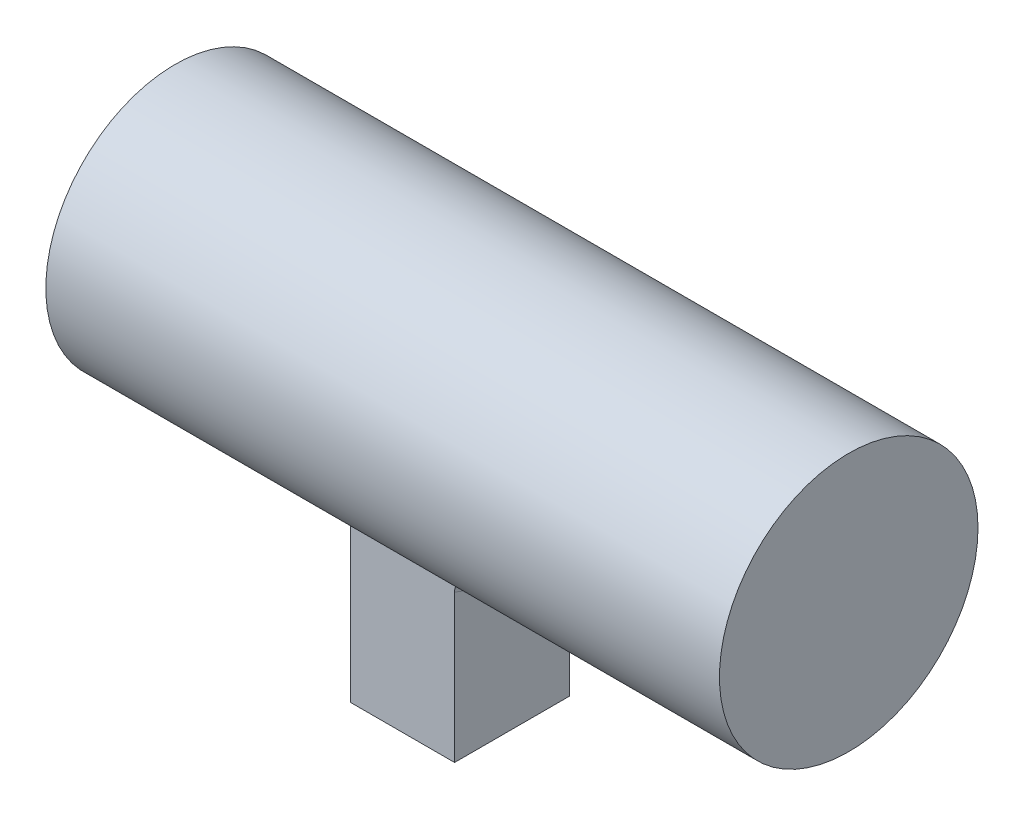
ISO-10303-21;
HEADER;
FILE_DESCRIPTION(('STEP AP214'),'2;1');
FILE_NAME('part.step','',(''),(''),'','','');
FILE_SCHEMA(('AUTOMOTIVE_DESIGN { 1 0 10303 214 1 1 1 1 }'));
ENDSEC;
DATA;
#1=APPLICATION_CONTEXT('core data for automotive mechanical design processes');
#2=APPLICATION_PROTOCOL_DEFINITION('international standard','automotive_design',2000,#1);
#3=PRODUCT_CONTEXT('',#1,'mechanical');
#4=PRODUCT('Part','Part','',(#3));
#5=PRODUCT_RELATED_PRODUCT_CATEGORY('part','',(#4));
#6=PRODUCT_DEFINITION_FORMATION('','',#4);
#7=PRODUCT_DEFINITION_CONTEXT('part definition',#1,'design');
#8=PRODUCT_DEFINITION('design','',#6,#7);
#9=PRODUCT_DEFINITION_SHAPE('','',#8);
#10=(LENGTH_UNIT() NAMED_UNIT(*) SI_UNIT(.MILLI.,.METRE.));
#11=(NAMED_UNIT(*) PLANE_ANGLE_UNIT() SI_UNIT($,.RADIAN.));
#12=(NAMED_UNIT(*) SI_UNIT($,.STERADIAN.) SOLID_ANGLE_UNIT());
#13=UNCERTAINTY_MEASURE_WITH_UNIT(LENGTH_MEASURE(1.E-05),#10,'distance_accuracy_value','');
#14=(GEOMETRIC_REPRESENTATION_CONTEXT(3) GLOBAL_UNCERTAINTY_ASSIGNED_CONTEXT((#13)) GLOBAL_UNIT_ASSIGNED_CONTEXT((#10,
#11,#12)) REPRESENTATION_CONTEXT('',''));
#15=CARTESIAN_POINT('',(0.,0.,0.));
#16=DIRECTION('',(0.,0.,1.));
#17=DIRECTION('',(1.,0.,0.));
#18=AXIS2_PLACEMENT_3D('',#15,#16,#17);
#19=CARTESIAN_POINT('',(-7.72253398772446,50.,-8.51233860010538));
#20=DIRECTION('',(0.,0.,1.));
#21=DIRECTION('',(1.,0.,0.));
#22=AXIS2_PLACEMENT_3D('',#19,#20,#21);
#23=PLANE('',#22);
#24=DIRECTION('',(-1.,0.,0.));
#25=VECTOR('',#24,1.);
#26=CARTESIAN_POINT('',(57.7225339877245,24.1122485716683,-8.51233860010537));
#27=LINE('',#26,#25);
#28=CARTESIAN_POINT('',(9.72253398772446,24.1122485716683,-8.51233860010537));
#29=VERTEX_POINT('',#28);
#30=CARTESIAN_POINT('',(-7.72253398772446,24.1122485716683,-8.51233860010538));
#31=VERTEX_POINT('',#30);
#32=EDGE_CURVE('E109',#29,#31,#27,.T.);
#33=ORIENTED_EDGE('',*,*,#32,.F.);
#34=CARTESIAN_POINT('',(9.72253398772446,24.1122485716683,-8.51233860010537));
#35=CARTESIAN_POINT('',(9.6703359654343,24.1122579967905,-8.51233860010537));
#36=CARTESIAN_POINT('',(9.61814260338134,24.1099687573812,-8.51233860010538));
#37=CARTESIAN_POINT('',(9.51416646896467,24.1008652430005,-8.51233860010538));
#38=CARTESIAN_POINT('',(9.46238358379587,24.0940522581644,-8.51233860010538));
#39=CARTESIAN_POINT('',(9.35978697758799,24.076006451072,-8.51233860010538));
#40=CARTESIAN_POINT('',(9.30897040984165,24.0647898454542,-8.51233860010538));
#41=CARTESIAN_POINT('',(9.20848645091498,24.0380818113668,-8.51233860010538));
#42=CARTESIAN_POINT('',(9.1588190999157,24.0225902336718,-8.51233860010538));
#43=CARTESIAN_POINT('',(9.01212093724642,23.9699707022534,-8.51233860010538));
#44=CARTESIAN_POINT('',(8.91723131163867,23.926668753286,-8.51233860010538));
#45=CARTESIAN_POINT('',(8.73565154431766,23.8254213131154,-8.51233860010538));
#46=CARTESIAN_POINT('',(8.64896707614099,23.7674657897538,-8.51233860010538));
#47=CARTESIAN_POINT('',(8.48187102011373,23.6361225748575,-8.51233860010538));
#48=CARTESIAN_POINT('',(8.40190869648102,23.5621640478425,-8.51233860010538));
#49=CARTESIAN_POINT('',(8.25418910710852,23.4029572099676,-8.51233860010538));
#50=CARTESIAN_POINT('',(8.18643535649543,23.3177056598091,-8.51233860010538));
#51=CARTESIAN_POINT('',(8.05809479757929,23.1294616458393,-8.51233860010538));
#52=CARTESIAN_POINT('',(7.99885689794439,23.0255495418724,-8.51233860010538));
#53=CARTESIAN_POINT('',(7.8970785781931,22.8098198392345,-8.51233860010538));
#54=CARTESIAN_POINT('',(7.85454693376625,22.6979981219897,-8.51233860010538));
#55=CARTESIAN_POINT('',(7.78812536075148,22.4737473208937,-8.51233860010538));
#56=CARTESIAN_POINT('',(7.76356906859393,22.3615144665228,-8.51233860010538));
#57=CARTESIAN_POINT('',(7.73077239919533,22.1348359492508,-8.51233860010538));
#58=CARTESIAN_POINT('',(7.72251118549379,22.0203933014458,-8.51233860010538));
#59=CARTESIAN_POINT('',(7.72253398772446,21.9059439682416,-8.51233860010538));
#60=B_SPLINE_CURVE_WITH_KNOTS('',3,(#34,#35,#36,#37,#38,#39,#40,#41,#42,#43,#44,#45,#46,#47,#48,
#49,#50,#51,#52,#53,#54,#55,#56,#57,#58,#59),.UNSPECIFIED.,.F.,.F.,(4,2,2,2,2,2,2,2,2,2,2,2,4),
(0.,0.156536034393611,0.313027445153472,0.46894789104007,0.624873780292929,0.936235938621686,
1.24781184225326,1.57321863892765,1.89871897845296,2.25605210227083,2.61357268068351,
2.95705592984447,3.3000996827),.UNSPECIFIED.);
#61=CARTESIAN_POINT('',(7.72253398772446,21.9059439682416,-8.51233860010538));
#62=VERTEX_POINT('',#61);
#63=EDGE_CURVE('E53',#29,#62,#60,.T.);
#64=ORIENTED_EDGE('',*,*,#63,.T.);
#65=DIRECTION('',(0.,-1.,0.));
#66=VECTOR('',#65,1.);
#67=CARTESIAN_POINT('',(7.72253398772446,50.,-8.51233860010538));
#68=LINE('',#67,#66);
#69=CARTESIAN_POINT('',(7.72253398772446,0.,-8.51233860010538));
#70=VERTEX_POINT('',#69);
#71=EDGE_CURVE('E89',#62,#70,#68,.T.);
#72=ORIENTED_EDGE('',*,*,#71,.T.);
#73=DIRECTION('',(-1.,0.,0.));
#74=VECTOR('',#73,1.);
#75=CARTESIAN_POINT('',(-7.72253398772446,0.,-8.51233860010538));
#76=LINE('',#75,#74);
#77=CARTESIAN_POINT('',(-7.72253398772446,0.,-8.51233860010538));
#78=VERTEX_POINT('',#77);
#79=EDGE_CURVE('E92',#70,#78,#76,.T.);
#80=ORIENTED_EDGE('',*,*,#79,.T.);
#81=DIRECTION('',(0.,-1.,0.));
#82=VECTOR('',#81,1.);
#83=CARTESIAN_POINT('',(-7.72253398772446,50.,-8.51233860010538));
#84=LINE('',#83,#82);
#85=EDGE_CURVE('E96',#31,#78,#84,.T.);
#86=ORIENTED_EDGE('',*,*,#85,.F.);
#87=EDGE_LOOP('',(#33,#64,#72,#80,#86));
#88=FACE_BOUND('',#87,.T.);
#89=ADVANCED_FACE('F39',(#88),#23,.F.);
#90=CARTESIAN_POINT('',(-7.72253398772446,50.,8.51233860010538));
#91=DIRECTION('',(0.,0.,-1.));
#92=DIRECTION('',(-1.,0.,0.));
#93=AXIS2_PLACEMENT_3D('',#90,#91,#92);
#94=PLANE('',#93);
#95=DIRECTION('',(-1.,0.,0.));
#96=VECTOR('',#95,1.);
#97=CARTESIAN_POINT('',(57.7225339877245,24.1122485716683,8.51233860010537));
#98=LINE('',#97,#96);
#99=CARTESIAN_POINT('',(-7.72253398772446,24.1122485716683,8.51233860010538));
#100=VERTEX_POINT('',#99);
#101=CARTESIAN_POINT('',(9.72253398772446,24.1122485716683,8.51233860010537));
#102=VERTEX_POINT('',#101);
#103=EDGE_CURVE('E95',#100,#102,#98,.F.);
#104=ORIENTED_EDGE('',*,*,#103,.F.);
#105=DIRECTION('',(0.,-1.,0.));
#106=VECTOR('',#105,1.);
#107=CARTESIAN_POINT('',(-7.72253398772446,50.,8.51233860010538));
#108=LINE('',#107,#106);
#109=CARTESIAN_POINT('',(-7.72253398772446,0.,8.51233860010538));
#110=VERTEX_POINT('',#109);
#111=EDGE_CURVE('E120',#100,#110,#108,.T.);
#112=ORIENTED_EDGE('',*,*,#111,.T.);
#113=DIRECTION('',(1.,0.,0.));
#114=VECTOR('',#113,1.);
#115=CARTESIAN_POINT('',(-7.72253398772446,0.,8.51233860010538));
#116=LINE('',#115,#114);
#117=CARTESIAN_POINT('',(7.72253398772446,0.,8.51233860010538));
#118=VERTEX_POINT('',#117);
#119=EDGE_CURVE('E117',#110,#118,#116,.T.);
#120=ORIENTED_EDGE('',*,*,#119,.T.);
#121=DIRECTION('',(0.,-1.,0.));
#122=VECTOR('',#121,1.);
#123=CARTESIAN_POINT('',(7.72253398772446,50.,8.51233860010538));
#124=LINE('',#123,#122);
#125=CARTESIAN_POINT('',(7.72253398772446,21.9059439682416,8.51233860010538));
#126=VERTEX_POINT('',#125);
#127=EDGE_CURVE('E107',#126,#118,#124,.T.);
#128=ORIENTED_EDGE('',*,*,#127,.F.);
#129=CARTESIAN_POINT('',(7.72253398772446,21.9059439682416,8.51233860010538));
#130=CARTESIAN_POINT('',(7.72248933365358,22.0391616687597,8.51233860010538));
#131=CARTESIAN_POINT('',(7.73369589453749,22.1723843171559,8.51233860010538));
#132=CARTESIAN_POINT('',(7.77810206087531,22.4353516900546,8.51233860010538));
#133=CARTESIAN_POINT('',(7.81134030842974,22.5650898863036,8.51233860010538));
#134=CARTESIAN_POINT('',(7.89934010304041,22.8172297804672,8.51233860010538));
#135=CARTESIAN_POINT('',(7.95412279851281,22.9396241330558,8.51233860010538));
#136=CARTESIAN_POINT('',(8.08423983508439,23.1729137609189,8.51233860010538));
#137=CARTESIAN_POINT('',(8.15955929118068,23.2838172846898,8.51233860010538));
#138=CARTESIAN_POINT('',(8.32591182241541,23.4858572586884,8.51233860010538));
#139=CARTESIAN_POINT('',(8.4161991028669,23.5776053084877,8.51233860010538));
#140=CARTESIAN_POINT('',(8.61237519257171,23.7426923559088,8.51233860010538));
#141=CARTESIAN_POINT('',(8.71825929027844,23.816036894908,8.51233860010538));
#142=CARTESIAN_POINT('',(8.93161909675808,23.9343976956789,8.51233860010538));
#143=CARTESIAN_POINT('',(9.03796068588276,23.9814610923258,8.51233860010538));
#144=CARTESIAN_POINT('',(9.2574725168064,24.0548316163529,8.51233860010538));
#145=CARTESIAN_POINT('',(9.37062636606774,24.0811865823839,8.51233860010538));
#146=CARTESIAN_POINT('',(9.52445968453838,24.1017234556513,8.51233860010538));
#147=CARTESIAN_POINT('',(9.56399996413893,24.1056697714275,8.51233860010538));
#148=CARTESIAN_POINT('',(9.64319778396251,24.1109289994153,8.51233860010538));
#149=CARTESIAN_POINT('',(9.68285507141521,24.1122457173432,8.51233860010538));
#150=CARTESIAN_POINT('',(9.72253398772446,24.1122485716683,8.51233860010538));
#151=B_SPLINE_CURVE_WITH_KNOTS('',3,(#129,#130,#131,#132,#133,#134,#135,#136,#137,#138,#139,
#140,#141,#142,#143,#144,#145,#146,#147,#148,#149,#150),.UNSPECIFIED.,.F.,.F.,(4,2,2,2,2,2,2,2,
2,2,4),(0.,0.3992036360533,0.799109307812798,1.19940851792471,1.59941835969906,1.98348784653894,
2.36744154922597,2.71443953008281,3.06063353293496,3.1797780085416,3.29874992558729),.UNSPECIFIED.);
#152=EDGE_CURVE('E11',#126,#102,#151,.T.);
#153=ORIENTED_EDGE('',*,*,#152,.T.);
#154=EDGE_LOOP('',(#104,#112,#120,#128,#153));
#155=FACE_BOUND('',#154,.T.);
#156=ADVANCED_FACE('F135',(#155),#94,.F.);
#157=CARTESIAN_POINT('',(7.72253398772446,50.,-8.51233860010538));
#158=DIRECTION('',(-1.,0.,0.));
#159=DIRECTION('',(0.,0.,1.));
#160=AXIS2_PLACEMENT_3D('',#157,#158,#159);
#161=PLANE('',#160);
#162=ORIENTED_EDGE('',*,*,#71,.F.);
#163=CARTESIAN_POINT('',(7.72253398772446,41.3121365168106,0.));
#164=DIRECTION('',(-1.,0.,0.));
#165=DIRECTION('',(0.,0.,1.));
#166=AXIS2_PLACEMENT_3D('',#163,#164,#165);
#167=CIRCLE('',#166,21.1910409766718);
#168=EDGE_CURVE('E66',#62,#126,#167,.T.);
#169=ORIENTED_EDGE('',*,*,#168,.T.);
#170=ORIENTED_EDGE('',*,*,#127,.T.);
#171=DIRECTION('',(0.,0.,-1.));
#172=VECTOR('',#171,1.);
#173=CARTESIAN_POINT('',(7.72253398772446,0.,-8.51233860010538));
#174=LINE('',#173,#172);
#175=EDGE_CURVE('E102',#118,#70,#174,.T.);
#176=ORIENTED_EDGE('',*,*,#175,.T.);
#177=EDGE_LOOP('',(#162,#169,#170,#176));
#178=FACE_BOUND('',#177,.T.);
#179=ADVANCED_FACE('F106',(#178),#161,.F.);
#180=CARTESIAN_POINT('',(-7.72253398772446,50.,-8.51233860010538));
#181=DIRECTION('',(1.,0.,0.));
#182=DIRECTION('',(0.,0.,-1.));
#183=AXIS2_PLACEMENT_3D('',#180,#181,#182);
#184=PLANE('',#183);
#185=CARTESIAN_POINT('',(-7.72253398772446,41.3121365168106,0.));
#186=DIRECTION('',(1.,0.,0.));
#187=DIRECTION('',(0.,0.,-1.));
#188=AXIS2_PLACEMENT_3D('',#185,#186,#187);
#189=CIRCLE('',#188,19.1910409766718);
#190=EDGE_CURVE('E112',#31,#100,#189,.F.);
#191=ORIENTED_EDGE('',*,*,#190,.F.);
#192=ORIENTED_EDGE('',*,*,#85,.T.);
#193=DIRECTION('',(0.,0.,1.));
#194=VECTOR('',#193,1.);
#195=CARTESIAN_POINT('',(-7.72253398772446,0.,-8.51233860010538));
#196=LINE('',#195,#194);
#197=EDGE_CURVE('E104',#78,#110,#196,.T.);
#198=ORIENTED_EDGE('',*,*,#197,.T.);
#199=ORIENTED_EDGE('',*,*,#111,.F.);
#200=EDGE_LOOP('',(#191,#192,#198,#199));
#201=FACE_BOUND('',#200,.T.);
#202=ADVANCED_FACE('F136',(#201),#184,.F.);
#203=CARTESIAN_POINT('',(0.,0.,0.));
#204=DIRECTION('',(0.,1.,0.));
#205=DIRECTION('',(0.,0.,1.));
#206=AXIS2_PLACEMENT_3D('',#203,#204,#205);
#207=PLANE('',#206);
#208=ORIENTED_EDGE('',*,*,#175,.F.);
#209=ORIENTED_EDGE('',*,*,#119,.F.);
#210=ORIENTED_EDGE('',*,*,#197,.F.);
#211=ORIENTED_EDGE('',*,*,#79,.F.);
#212=EDGE_LOOP('',(#208,#209,#210,#211));
#213=FACE_BOUND('',#212,.T.);
#214=ADVANCED_FACE('F100',(#213),#207,.F.);
#215=CARTESIAN_POINT('',(57.7225339877245,41.3121365168106,0.));
#216=DIRECTION('',(-1.,0.,0.));
#217=DIRECTION('',(0.,0.,1.));
#218=AXIS2_PLACEMENT_3D('',#215,#216,#217);
#219=CYLINDRICAL_SURFACE('',#218,19.1910409766718);
#220=CARTESIAN_POINT('',(57.7225339877245,41.3121365168106,0.));
#221=DIRECTION('',(1.,0.,0.));
#222=DIRECTION('',(0.,0.,-1.));
#223=AXIS2_PLACEMENT_3D('',#220,#221,#222);
#224=CIRCLE('',#223,19.1910409766718);
#225=CARTESIAN_POINT('',(57.7225339877245,41.3121365168106,-19.1910409766718));
#226=VERTEX_POINT('',#225);
#227=EDGE_CURVE('E169',#226,#226,#224,.T.);
#228=ORIENTED_EDGE('',*,*,#227,.F.);
#229=EDGE_LOOP('',(#228));
#230=FACE_BOUND('',#229,.T.);
#231=CARTESIAN_POINT('',(-42.2774660122755,41.3121365168106,0.));
#232=DIRECTION('',(1.,0.,0.));
#233=DIRECTION('',(0.,0.,-1.));
#234=AXIS2_PLACEMENT_3D('',#231,#232,#233);
#235=CIRCLE('',#234,19.1910409766718);
#236=CARTESIAN_POINT('',(-42.2774660122755,41.3121365168106,-19.1910409766718));
#237=VERTEX_POINT('',#236);
#238=EDGE_CURVE('E167',#237,#237,#235,.T.);
#239=ORIENTED_EDGE('',*,*,#238,.T.);
#240=EDGE_LOOP('',(#239));
#241=FACE_BOUND('',#240,.T.);
#242=CARTESIAN_POINT('',(9.72253398772446,41.3121365168106,0.));
#243=DIRECTION('',(-1.,0.,0.));
#244=DIRECTION('',(0.,0.,1.));
#245=AXIS2_PLACEMENT_3D('',#242,#243,#244);
#246=CIRCLE('',#245,19.1910409766718);
#247=EDGE_CURVE('E124',#102,#29,#246,.F.);
#248=ORIENTED_EDGE('',*,*,#247,.T.);
#249=ORIENTED_EDGE('',*,*,#32,.T.);
#250=ORIENTED_EDGE('',*,*,#190,.T.);
#251=ORIENTED_EDGE('',*,*,#103,.T.);
#252=EDGE_LOOP('',(#248,#249,#250,#251));
#253=FACE_BOUND('',#252,.T.);
#254=ADVANCED_FACE('F150',(#230,#241,#253),#219,.T.);
#255=CARTESIAN_POINT('',(57.7225339877245,41.3121365168106,0.));
#256=DIRECTION('',(1.,0.,0.));
#257=DIRECTION('',(0.,0.,-1.));
#258=AXIS2_PLACEMENT_3D('',#255,#256,#257);
#259=PLANE('',#258);
#260=ORIENTED_EDGE('',*,*,#227,.T.);
#261=EDGE_LOOP('',(#260));
#262=FACE_BOUND('',#261,.T.);
#263=ADVANCED_FACE('F153',(#262),#259,.T.);
#264=CARTESIAN_POINT('',(-42.2774660122755,41.3121365168106,0.));
#265=DIRECTION('',(1.,0.,0.));
#266=DIRECTION('',(0.,0.,-1.));
#267=AXIS2_PLACEMENT_3D('',#264,#265,#266);
#268=PLANE('',#267);
#269=ORIENTED_EDGE('',*,*,#238,.F.);
#270=EDGE_LOOP('',(#269));
#271=FACE_BOUND('',#270,.T.);
#272=ADVANCED_FACE('F157',(#271),#268,.F.);
#273=CARTESIAN_POINT('',(9.72253398772446,41.3121365168106,0.));
#274=DIRECTION('',(-1.,0.,0.));
#275=DIRECTION('',(0.,0.,1.));
#276=AXIS2_PLACEMENT_3D('',#273,#274,#275);
#277=TOROIDAL_SURFACE('',#276,21.1910409766718,2.);
#278=ORIENTED_EDGE('',*,*,#152,.F.);
#279=ORIENTED_EDGE('',*,*,#168,.F.);
#280=ORIENTED_EDGE('',*,*,#63,.F.);
#281=ORIENTED_EDGE('',*,*,#247,.F.);
#282=EDGE_LOOP('',(#278,#279,#280,#281));
#283=FACE_BOUND('',#282,.T.);
#284=ADVANCED_FACE('F41',(#283),#277,.F.);
#285=CLOSED_SHELL('',(#89,#156,#179,#202,#214,#254,#263,#272,#284));
#286=MANIFOLD_SOLID_BREP('B2',#285);
#287=ADVANCED_BREP_SHAPE_REPRESENTATION('',(#18,#286),#14);
#288=SHAPE_DEFINITION_REPRESENTATION(#9,#287);
ENDSEC;
END-ISO-10303-21;
